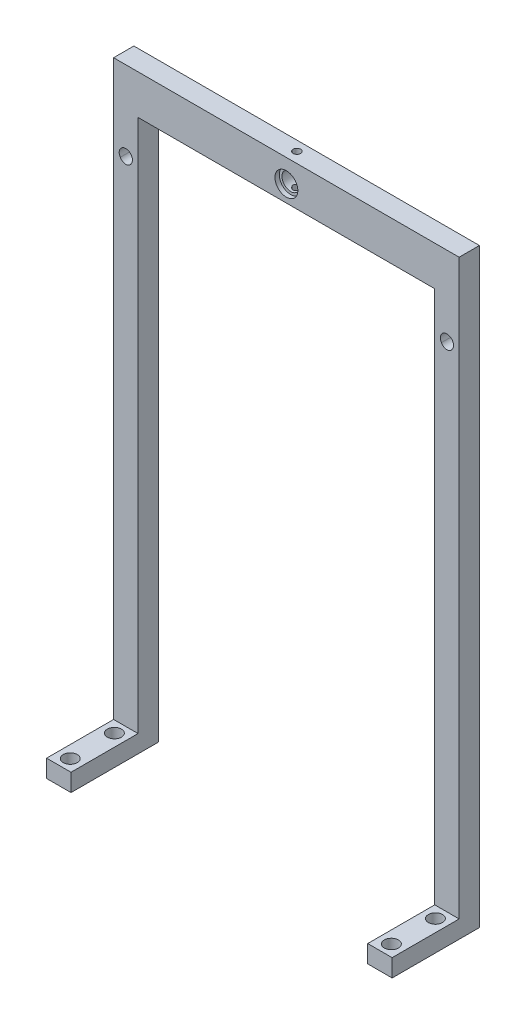
ISO-10303-21;
HEADER;
FILE_DESCRIPTION(('STEP AP214'),'2;1');
FILE_NAME('part.step','',(''),(''),'','','');
FILE_SCHEMA(('AUTOMOTIVE_DESIGN { 1 0 10303 214 1 1 1 1 }'));
ENDSEC;
DATA;
#1=APPLICATION_CONTEXT('core data for automotive mechanical design processes');
#2=APPLICATION_PROTOCOL_DEFINITION('international standard','automotive_design',2000,#1);
#3=PRODUCT_CONTEXT('',#1,'mechanical');
#4=PRODUCT('Part','Part','',(#3));
#5=PRODUCT_RELATED_PRODUCT_CATEGORY('part','',(#4));
#6=PRODUCT_DEFINITION_FORMATION('','',#4);
#7=PRODUCT_DEFINITION_CONTEXT('part definition',#1,'design');
#8=PRODUCT_DEFINITION('design','',#6,#7);
#9=PRODUCT_DEFINITION_SHAPE('','',#8);
#10=(LENGTH_UNIT() NAMED_UNIT(*) SI_UNIT(.MILLI.,.METRE.));
#11=(NAMED_UNIT(*) PLANE_ANGLE_UNIT() SI_UNIT($,.RADIAN.));
#12=(NAMED_UNIT(*) SI_UNIT($,.STERADIAN.) SOLID_ANGLE_UNIT());
#13=UNCERTAINTY_MEASURE_WITH_UNIT(LENGTH_MEASURE(1.E-05),#10,'distance_accuracy_value','');
#14=(GEOMETRIC_REPRESENTATION_CONTEXT(3) GLOBAL_UNCERTAINTY_ASSIGNED_CONTEXT((#13)) GLOBAL_UNIT_ASSIGNED_CONTEXT((#10,
#11,#12)) REPRESENTATION_CONTEXT('',''));
#15=CARTESIAN_POINT('',(0.,0.,0.));
#16=DIRECTION('',(0.,0.,1.));
#17=DIRECTION('',(1.,0.,0.));
#18=AXIS2_PLACEMENT_3D('',#15,#16,#17);
#19=CARTESIAN_POINT('',(-107.509028277649,163.576,-56.7765959430233));
#20=DIRECTION('',(0.,0.,1.));
#21=DIRECTION('',(1.,0.,0.));
#22=AXIS2_PLACEMENT_3D('',#19,#20,#21);
#23=CYLINDRICAL_SURFACE('',#22,2.54);
#24=CARTESIAN_POINT('',(-107.509028277649,161.036,-52.9030959430234));
#25=CARTESIAN_POINT('',(-107.566754056528,161.036004949209,-52.9031024767732));
#26=CARTESIAN_POINT('',(-107.62456541484,161.037990498758,-52.9077535295618));
#27=CARTESIAN_POINT('',(-107.738545101737,161.045741764065,-52.9261901695404));
#28=CARTESIAN_POINT('',(-107.794708856702,161.05151712185,-52.939999057043));
#29=CARTESIAN_POINT('',(-107.903555948322,161.066228536338,-52.976144809449));
#30=CARTESIAN_POINT('',(-107.956250543099,161.075153703491,-52.9984523137267));
#31=CARTESIAN_POINT('',(-108.057096773447,161.095300723254,-53.050838400811));
#32=CARTESIAN_POINT('',(-108.105249678348,161.106521931362,-53.080914803499));
#33=CARTESIAN_POINT('',(-108.198218460849,161.130793738901,-53.1496286471514));
#34=CARTESIAN_POINT('',(-108.242768366083,161.143905802221,-53.1886040243645));
#35=CARTESIAN_POINT('',(-108.324929780163,161.170221633979,-53.2732941637497));
#36=CARTESIAN_POINT('',(-108.362537497755,161.183425448464,-53.3190125840468));
#37=CARTESIAN_POINT('',(-108.431670032574,161.209195244001,-53.4187519693264));
#38=CARTESIAN_POINT('',(-108.462780148128,161.221693018099,-53.4730798659445));
#39=CARTESIAN_POINT('',(-108.515301683983,161.243655628489,-53.5868043819622));
#40=CARTESIAN_POINT('',(-108.536718299028,161.253122088465,-53.6461982661707));
#41=CARTESIAN_POINT('',(-108.568135316814,161.267282242767,-53.7653069340825));
#42=CARTESIAN_POINT('',(-108.578648720386,161.272189148273,-53.8248600535432));
#43=CARTESIAN_POINT('',(-108.589560031115,161.277284857388,-53.9450716504944));
#44=CARTESIAN_POINT('',(-108.58996384601,161.277476416503,-54.0057294616943));
#45=CARTESIAN_POINT('',(-108.581029754182,161.273299484289,-54.1212210328693));
#46=CARTESIAN_POINT('',(-108.572472173105,161.269296243058,-54.1761310659081));
#47=CARTESIAN_POINT('',(-108.547171100001,161.257800160635,-54.2836457653623));
#48=CARTESIAN_POINT('',(-108.530425964452,161.250306618834,-54.3362499666068));
#49=CARTESIAN_POINT('',(-108.48889604585,161.232503230194,-54.4390154129461));
#50=CARTESIAN_POINT('',(-108.463944905922,161.222135872553,-54.4890990161583));
#51=CARTESIAN_POINT('',(-108.406829387342,161.199765081749,-54.5845683931012));
#52=CARTESIAN_POINT('',(-108.374662101511,161.187760989959,-54.6299522626433));
#53=CARTESIAN_POINT('',(-108.30069639484,161.162181043929,-54.7189502224163));
#54=CARTESIAN_POINT('',(-108.258298491796,161.148559977934,-54.7620545402123));
#55=CARTESIAN_POINT('',(-108.166746471729,161.122171373586,-54.8407162353623));
#56=CARTESIAN_POINT('',(-108.117590648008,161.109404052058,-54.8762717004812));
#57=CARTESIAN_POINT('',(-108.012315593403,161.085763106793,-54.9396155749312));
#58=CARTESIAN_POINT('',(-107.956053477482,161.074944537042,-54.9671885962195));
#59=CARTESIAN_POINT('',(-107.839111777642,161.056846096832,-55.01229797408));
#60=CARTESIAN_POINT('',(-107.778434759068,161.049564189926,-55.0298401075729));
#61=CARTESIAN_POINT('',(-107.658638856613,161.039744737666,-55.0533042151602));
#62=CARTESIAN_POINT('',(-107.599676708101,161.03692858566,-55.0599098168799));
#63=CARTESIAN_POINT('',(-107.481423602037,161.035462621601,-55.0633614204787));
#64=CARTESIAN_POINT('',(-107.422132749196,161.036811551206,-55.0602103700113));
#65=CARTESIAN_POINT('',(-107.30815991757,161.043344538528,-55.0447203005117));
#66=CARTESIAN_POINT('',(-107.253398730006,161.048325190751,-55.0328683693606));
#67=CARTESIAN_POINT('',(-107.146706388447,161.061399923596,-55.0009987019312));
#68=CARTESIAN_POINT('',(-107.094775589222,161.069494393495,-54.9809799446524));
#69=CARTESIAN_POINT('',(-106.993386485371,161.088339120478,-54.9326934775513));
#70=CARTESIAN_POINT('',(-106.944055842566,161.099164346772,-54.9041879260995));
#71=CARTESIAN_POINT('',(-106.850700607611,161.122324842366,-54.8399974549462));
#72=CARTESIAN_POINT('',(-106.806678279594,161.134660751523,-54.80430948896));
#73=CARTESIAN_POINT('',(-106.721752604574,161.160650506563,-54.7236727892713));
#74=CARTESIAN_POINT('',(-106.68132310147,161.174334223917,-54.6782333734531));
#75=CARTESIAN_POINT('',(-106.608523009312,161.200669998012,-54.5810101575556));
#76=CARTESIAN_POINT('',(-106.576154533315,161.213321783666,-54.5292246992686));
#77=CARTESIAN_POINT('',(-106.519964167941,161.236279331013,-54.4195508625652));
#78=CARTESIAN_POINT('',(-106.496294952322,161.246542121484,-54.3615745912061));
#79=CARTESIAN_POINT('',(-106.459263961427,161.262990488762,-54.2418840818804));
#80=CARTESIAN_POINT('',(-106.445893221838,161.269179610811,-54.180173145344));
#81=CARTESIAN_POINT('',(-106.43074634322,161.276223610781,-54.0600442892869));
#82=CARTESIAN_POINT('',(-106.428133852785,161.277463024887,-54.0017539755865));
#83=CARTESIAN_POINT('',(-106.432326449693,161.275495943584,-53.8855956958247));
#84=CARTESIAN_POINT('',(-106.439129944289,161.272290200089,-53.8277276599979));
#85=CARTESIAN_POINT('',(-106.461249572185,161.262151472107,-53.7170679132632));
#86=CARTESIAN_POINT('',(-106.476119615298,161.255414382934,-53.6641673308636));
#87=CARTESIAN_POINT('',(-106.513504162709,161.239133473727,-53.5616048711624));
#88=CARTESIAN_POINT('',(-106.536020832798,161.229588858608,-53.5119439161917));
#89=CARTESIAN_POINT('',(-106.589649670089,161.208041865904,-53.4139370520736));
#90=CARTESIAN_POINT('',(-106.621204923353,161.195924518334,-53.3658593730151));
#91=CARTESIAN_POINT('',(-106.691408202969,161.170904355187,-53.2754202378993));
#92=CARTESIAN_POINT('',(-106.730058845152,161.158001251104,-53.2330609000291));
#93=CARTESIAN_POINT('',(-106.81688721804,161.131669597424,-53.1518986813878));
#94=CARTESIAN_POINT('',(-106.865569567185,161.118277169726,-53.1136213389222));
#95=CARTESIAN_POINT('',(-106.969156149136,161.093466954015,-53.0457441093074));
#96=CARTESIAN_POINT('',(-107.024063189022,161.082050062798,-53.0161481588635));
#97=CARTESIAN_POINT('',(-107.13778294314,161.062624857076,-52.9670786524232));
#98=CARTESIAN_POINT('',(-107.196523588025,161.054567360423,-52.9474580451362));
#99=CARTESIAN_POINT('',(-107.316783781995,161.04257078012,-52.9185651054773));
#100=CARTESIAN_POINT('',(-107.378294068086,161.03861889829,-52.9092606091975));
#101=CARTESIAN_POINT('',(-107.463046403608,161.036310416403,-52.9038279127191));
#102=CARTESIAN_POINT('',(-107.486030549066,161.035998028254,-52.9030933400025));
#103=CARTESIAN_POINT('',(-107.509028277649,161.036,-52.9030959430234));
#104=B_SPLINE_CURVE_WITH_KNOTS('',3,(#24,#25,#26,#27,#28,#29,#30,#31,#32,#33,#34,#35,#36,#37,
#38,#39,#40,#41,#42,#43,#44,#45,#46,#47,#48,#49,#50,#51,#52,#53,#54,#55,#56,#57,#58,#59,#60,#61,
#62,#63,#64,#65,#66,#67,#68,#69,#70,#71,#72,#73,#74,#75,#76,#77,#78,#79,#80,#81,#82,#83,#84,#85,
#86,#87,#88,#89,#90,#91,#92,#93,#94,#95,#96,#97,#98,#99,#100,#101,#102,#103),.UNSPECIFIED.,.T.,
.F.,(4,2,2,2,2,2,2,2,2,2,2,2,2,2,2,2,2,2,2,2,2,2,2,2,2,2,2,2,2,2,2,2,2,2,2,2,2,2,2,4),(0.,
0.173109941172707,0.346662025086487,0.519619888024115,0.692529267928443,0.873625999526085,
1.05482134060156,1.24537892761079,1.43583427363817,1.61685440897315,1.797768759139,
1.96414317527463,2.13055100220201,2.30056491047798,2.47064743587896,2.65574212649887,
2.84088364852489,3.03063409980792,3.22027516095429,3.39754013167779,3.57475155280992,
3.74273321092931,3.91073587622432,4.08397929751027,4.25729635214369,4.44347432982142,
4.62970105956506,4.81905553672167,5.0082450033598,5.18241214565643,5.35654983056322,
5.5219153070896,5.68732765999135,5.8629022753795,6.0385417496761,6.22771491601778,
6.41697373357776,6.60335522726164,6.78915396607244,6.85812030172787),.UNSPECIFIED.);
#105=CARTESIAN_POINT('',(-107.509028277649,161.036,-52.9030959430234));
#106=VERTEX_POINT('',#105);
#107=EDGE_CURVE('E181',#106,#106,#104,.T.);
#108=ORIENTED_EDGE('',*,*,#107,.T.);
#109=EDGE_LOOP('',(#108));
#110=FACE_BOUND('',#109,.T.);
#111=CARTESIAN_POINT('',(-107.509028277649,166.116,-52.9030959430234));
#112=CARTESIAN_POINT('',(-107.451302498771,166.115995050791,-52.9031024767732));
#113=CARTESIAN_POINT('',(-107.393491140458,166.114009501242,-52.9077535295618));
#114=CARTESIAN_POINT('',(-107.279511453561,166.106258235935,-52.9261901695404));
#115=CARTESIAN_POINT('',(-107.223347698597,166.10048287815,-52.939999057043));
#116=CARTESIAN_POINT('',(-107.114500606976,166.085771463662,-52.976144809449));
#117=CARTESIAN_POINT('',(-107.0618060122,166.076846296509,-52.9984523137267));
#118=CARTESIAN_POINT('',(-106.960959781851,166.056699276746,-53.050838400811));
#119=CARTESIAN_POINT('',(-106.912806876951,166.045478068638,-53.080914803499));
#120=CARTESIAN_POINT('',(-106.81983809445,166.021206261099,-53.1496286471514));
#121=CARTESIAN_POINT('',(-106.775288189216,166.008094197779,-53.1886040243645));
#122=CARTESIAN_POINT('',(-106.693126775136,165.981778366021,-53.2732941637497));
#123=CARTESIAN_POINT('',(-106.655519057543,165.968574551536,-53.3190125840468));
#124=CARTESIAN_POINT('',(-106.586386522724,165.942804755999,-53.4187519693264));
#125=CARTESIAN_POINT('',(-106.555276407171,165.930306981902,-53.4730798659445));
#126=CARTESIAN_POINT('',(-106.502754871315,165.908344371511,-53.5868043819622));
#127=CARTESIAN_POINT('',(-106.481338256271,165.898877911535,-53.6461982661707));
#128=CARTESIAN_POINT('',(-106.449921238485,165.884717757233,-53.7653069340825));
#129=CARTESIAN_POINT('',(-106.439407834913,165.879810851727,-53.8248600535432));
#130=CARTESIAN_POINT('',(-106.428496524184,165.874715142612,-53.9450716504944));
#131=CARTESIAN_POINT('',(-106.428092709289,165.874523583497,-54.0057294616943));
#132=CARTESIAN_POINT('',(-106.437026801116,165.878700515711,-54.1212210328693));
#133=CARTESIAN_POINT('',(-106.445584382194,165.882703756942,-54.1761310659081));
#134=CARTESIAN_POINT('',(-106.470885455297,165.894199839365,-54.2836457653624));
#135=CARTESIAN_POINT('',(-106.487630590847,165.901693381166,-54.3362499666069));
#136=CARTESIAN_POINT('',(-106.529160509449,165.919496769806,-54.4390154129461));
#137=CARTESIAN_POINT('',(-106.554111649377,165.929864127447,-54.4890990161583));
#138=CARTESIAN_POINT('',(-106.611227167957,165.952234918251,-54.5845683931012));
#139=CARTESIAN_POINT('',(-106.643394453788,165.964239010041,-54.6299522626433));
#140=CARTESIAN_POINT('',(-106.717360160459,165.989818956071,-54.7189502224163));
#141=CARTESIAN_POINT('',(-106.759758063502,166.003440022066,-54.7620545402123));
#142=CARTESIAN_POINT('',(-106.85131008357,166.029828626414,-54.8407162353623));
#143=CARTESIAN_POINT('',(-106.900465907291,166.042595947942,-54.8762717004812));
#144=CARTESIAN_POINT('',(-107.005740961896,166.066236893207,-54.9396155749312));
#145=CARTESIAN_POINT('',(-107.062003077817,166.077055462958,-54.9671885962195));
#146=CARTESIAN_POINT('',(-107.178944777657,166.095153903168,-55.01229797408));
#147=CARTESIAN_POINT('',(-107.239621796231,166.102435810074,-55.0298401075729));
#148=CARTESIAN_POINT('',(-107.359417698685,166.112255262334,-55.0533042151602));
#149=CARTESIAN_POINT('',(-107.418379847198,166.11507141434,-55.0599098168799));
#150=CARTESIAN_POINT('',(-107.536632953261,166.116537378399,-55.0633614204787));
#151=CARTESIAN_POINT('',(-107.595923806102,166.115188448794,-55.0602103700113));
#152=CARTESIAN_POINT('',(-107.709896637729,166.108655461472,-55.0447203005116));
#153=CARTESIAN_POINT('',(-107.764657825293,166.103674809249,-55.0328683693606));
#154=CARTESIAN_POINT('',(-107.871350166852,166.090600076404,-55.0009987019312));
#155=CARTESIAN_POINT('',(-107.923280966076,166.082505606505,-54.9809799446524));
#156=CARTESIAN_POINT('',(-108.024670069927,166.063660879522,-54.9326934775513));
#157=CARTESIAN_POINT('',(-108.074000712732,166.052835653228,-54.9041879260994));
#158=CARTESIAN_POINT('',(-108.167355947687,166.029675157634,-54.8399974549462));
#159=CARTESIAN_POINT('',(-108.211378275705,166.017339248477,-54.80430948896));
#160=CARTESIAN_POINT('',(-108.296303950725,165.991349493437,-54.7236727892713));
#161=CARTESIAN_POINT('',(-108.336733453829,165.977665776083,-54.6782333734531));
#162=CARTESIAN_POINT('',(-108.409533545987,165.951330001989,-54.5810101575555));
#163=CARTESIAN_POINT('',(-108.441902021984,165.938678216334,-54.5292246992686));
#164=CARTESIAN_POINT('',(-108.498092387358,165.915720668987,-54.4195508625652));
#165=CARTESIAN_POINT('',(-108.521761602976,165.905457878516,-54.3615745912061));
#166=CARTESIAN_POINT('',(-108.558792593872,165.889009511238,-54.2418840818804));
#167=CARTESIAN_POINT('',(-108.572163333461,165.882820389189,-54.1801731453439));
#168=CARTESIAN_POINT('',(-108.587310212079,165.875776389219,-54.0600442892869));
#169=CARTESIAN_POINT('',(-108.589922702514,165.874536975113,-54.0017539755865));
#170=CARTESIAN_POINT('',(-108.585730105606,165.876504056416,-53.8855956958247));
#171=CARTESIAN_POINT('',(-108.57892661101,165.879709799911,-53.8277276599979));
#172=CARTESIAN_POINT('',(-108.556806983113,165.889848527893,-53.7170679132632));
#173=CARTESIAN_POINT('',(-108.541936940001,165.896585617066,-53.6641673308636));
#174=CARTESIAN_POINT('',(-108.504552392589,165.912866526273,-53.5616048711624));
#175=CARTESIAN_POINT('',(-108.4820357225,165.922411141392,-53.5119439161917));
#176=CARTESIAN_POINT('',(-108.42840688521,165.943958134096,-53.4139370520736));
#177=CARTESIAN_POINT('',(-108.396851631946,165.956075481666,-53.3658593730151));
#178=CARTESIAN_POINT('',(-108.32664835233,165.981095644813,-53.2754202378993));
#179=CARTESIAN_POINT('',(-108.287997710147,165.993998748896,-53.2330609000291));
#180=CARTESIAN_POINT('',(-108.201169337258,166.020330402576,-53.1518986813878));
#181=CARTESIAN_POINT('',(-108.152486988113,166.033722830274,-53.1136213389222));
#182=CARTESIAN_POINT('',(-108.048900406162,166.058533045985,-53.0457441093074));
#183=CARTESIAN_POINT('',(-107.993993366277,166.069949937202,-53.0161481588635));
#184=CARTESIAN_POINT('',(-107.880273612159,166.089375142924,-52.9670786524232));
#185=CARTESIAN_POINT('',(-107.821532967273,166.097432639577,-52.9474580451362));
#186=CARTESIAN_POINT('',(-107.701272773304,166.10942921988,-52.9185651054773));
#187=CARTESIAN_POINT('',(-107.639762487213,166.11338110171,-52.9092606091975));
#188=CARTESIAN_POINT('',(-107.55501015169,166.115689583597,-52.9038279127191));
#189=CARTESIAN_POINT('',(-107.532026006232,166.116001971746,-52.9030933400025));
#190=CARTESIAN_POINT('',(-107.509028277649,166.116,-52.9030959430234));
#191=B_SPLINE_CURVE_WITH_KNOTS('',3,(#111,#112,#113,#114,#115,#116,#117,#118,#119,#120,#121,
#122,#123,#124,#125,#126,#127,#128,#129,#130,#131,#132,#133,#134,#135,#136,#137,#138,#139,#140,
#141,#142,#143,#144,#145,#146,#147,#148,#149,#150,#151,#152,#153,#154,#155,#156,#157,#158,#159,
#160,#161,#162,#163,#164,#165,#166,#167,#168,#169,#170,#171,#172,#173,#174,#175,#176,#177,#178,
#179,#180,#181,#182,#183,#184,#185,#186,#187,#188,#189,#190),.UNSPECIFIED.,.T.,.F.,(4,2,2,2,2,2,
2,2,2,2,2,2,2,2,2,2,2,2,2,2,2,2,2,2,2,2,2,2,2,2,2,2,2,2,2,2,2,2,2,4),(0.,0.173109941172707,
0.346662025086501,0.519619888024129,0.692529267928457,0.873625999526099,1.05482134060157,
1.2453789276108,1.43583427363819,1.61685440897316,1.79776875913903,1.96414317527467,
2.13055100220204,2.30056491047798,2.47064743587895,2.65574212649886,2.84088364852491,
3.03063409980796,3.22027516095432,3.39754013167785,3.57475155280994,3.74273321092934,
3.91073587622435,4.08397929751031,4.25729635214372,4.44347432982147,4.62970105956509,
4.81905553672169,5.00824500335982,5.18241214565646,5.35654983056325,5.52191530708963,
5.68732765999137,5.86290227537952,6.03854174967612,6.2277149160178,6.4169737335778,
6.60335522726167,6.78915396607246,6.85812030172788),.UNSPECIFIED.);
#192=CARTESIAN_POINT('',(-107.509028277649,166.116,-52.9030959430234));
#193=VERTEX_POINT('',#192);
#194=EDGE_CURVE('E174',#193,#193,#191,.T.);
#195=ORIENTED_EDGE('',*,*,#194,.T.);
#196=EDGE_LOOP('',(#195));
#197=FACE_BOUND('',#196,.T.);
#198=CARTESIAN_POINT('',(-107.509028277649,163.576,-56.7765959430233));
#199=DIRECTION('',(0.,0.,1.));
#200=DIRECTION('',(1.,0.,0.));
#201=AXIS2_PLACEMENT_3D('',#198,#199,#200);
#202=CIRCLE('',#201,2.54);
#203=CARTESIAN_POINT('',(-104.969028277649,163.576,-56.7765959430233));
#204=VERTEX_POINT('',#203);
#205=EDGE_CURVE('E223',#204,#204,#202,.T.);
#206=ORIENTED_EDGE('',*,*,#205,.F.);
#207=EDGE_LOOP('',(#206));
#208=FACE_BOUND('',#207,.T.);
#209=CARTESIAN_POINT('',(-107.509028277649,163.576,-52.2045959430234));
#210=DIRECTION('',(0.,0.,1.));
#211=DIRECTION('',(1.,0.,0.));
#212=AXIS2_PLACEMENT_3D('',#209,#210,#211);
#213=CIRCLE('',#212,2.54);
#214=CARTESIAN_POINT('',(-104.969028277649,163.576,-52.2045959430234));
#215=VERTEX_POINT('',#214);
#216=EDGE_CURVE('E226',#215,#215,#213,.F.);
#217=ORIENTED_EDGE('',*,*,#216,.F.);
#218=EDGE_LOOP('',(#217));
#219=FACE_BOUND('',#218,.T.);
#220=ADVANCED_FACE('F33',(#110,#197,#208,#219),#23,.F.);
#221=CARTESIAN_POINT('',(-157.280328277649,170.18,-50.9345959430234));
#222=DIRECTION('',(0.,0.,-1.));
#223=DIRECTION('',(-1.,0.,0.));
#224=AXIS2_PLACEMENT_3D('',#221,#222,#223);
#225=PLANE('',#224);
#226=CARTESIAN_POINT('',(-61.2556282776494,147.116,-50.9345959430234));
#227=DIRECTION('',(0.,0.,1.));
#228=DIRECTION('',(1.,0.,0.));
#229=AXIS2_PLACEMENT_3D('',#226,#227,#228);
#230=CIRCLE('',#229,1.778);
#231=CARTESIAN_POINT('',(-62.8466169443281,146.32225,-50.9345959430234));
#232=VERTEX_POINT('',#231);
#233=CARTESIAN_POINT('',(-59.6646396109707,146.32225,-50.9345959430234));
#234=VERTEX_POINT('',#233);
#235=EDGE_CURVE('E153',#232,#234,#230,.T.);
#236=ORIENTED_EDGE('',*,*,#235,.F.);
#237=CARTESIAN_POINT('',(-61.2556282776494,147.37,-50.9345959430234));
#238=DIRECTION('',(0.,0.,1.));
#239=DIRECTION('',(1.,0.,0.));
#240=AXIS2_PLACEMENT_3D('',#237,#238,#239);
#241=CIRCLE('',#240,1.905);
#242=EDGE_CURVE('E144',#234,#232,#241,.T.);
#243=ORIENTED_EDGE('',*,*,#242,.F.);
#244=EDGE_LOOP('',(#236,#243));
#245=FACE_BOUND('',#244,.T.);
#246=CARTESIAN_POINT('',(-153.762428277649,147.116,-50.9345959430234));
#247=DIRECTION('',(0.,0.,1.));
#248=DIRECTION('',(1.,0.,0.));
#249=AXIS2_PLACEMENT_3D('',#246,#247,#248);
#250=CIRCLE('',#249,1.778);
#251=CARTESIAN_POINT('',(-155.353416944328,146.32225,-50.9345959430234));
#252=VERTEX_POINT('',#251);
#253=CARTESIAN_POINT('',(-152.171439610971,146.32225,-50.9345959430234));
#254=VERTEX_POINT('',#253);
#255=EDGE_CURVE('E159',#252,#254,#250,.T.);
#256=ORIENTED_EDGE('',*,*,#255,.F.);
#257=CARTESIAN_POINT('',(-153.762428277649,147.37,-50.9345959430234));
#258=DIRECTION('',(0.,0.,1.));
#259=DIRECTION('',(1.,0.,0.));
#260=AXIS2_PLACEMENT_3D('',#257,#258,#259);
#261=CIRCLE('',#260,1.90499999999999);
#262=EDGE_CURVE('E161',#254,#252,#261,.T.);
#263=ORIENTED_EDGE('',*,*,#262,.F.);
#264=EDGE_LOOP('',(#256,#263));
#265=FACE_BOUND('',#264,.T.);
#266=CARTESIAN_POINT('',(-107.509028277649,163.576,-50.9345959430234));
#267=DIRECTION('',(0.,0.,1.));
#268=DIRECTION('',(1.,0.,0.));
#269=AXIS2_PLACEMENT_3D('',#266,#267,#268);
#270=CIRCLE('',#269,3.302);
#271=CARTESIAN_POINT('',(-104.207028277649,163.576,-50.9345959430234));
#272=VERTEX_POINT('',#271);
#273=EDGE_CURVE('E233',#272,#272,#270,.T.);
#274=ORIENTED_EDGE('',*,*,#273,.F.);
#275=EDGE_LOOP('',(#274));
#276=FACE_BOUND('',#275,.T.);
#277=DIRECTION('',(-1.,0.,0.));
#278=VECTOR('',#277,1.);
#279=CARTESIAN_POINT('',(-64.7735282776494,5.08,-50.9345959430234));
#280=LINE('',#279,#278);
#281=CARTESIAN_POINT('',(-57.7377282776494,5.08,-50.9345959430234));
#282=VERTEX_POINT('',#281);
#283=CARTESIAN_POINT('',(-64.7735282776494,5.08,-50.9345959430234));
#284=VERTEX_POINT('',#283);
#285=EDGE_CURVE('E262',#282,#284,#280,.T.);
#286=ORIENTED_EDGE('',*,*,#285,.F.);
#287=DIRECTION('',(0.,-1.,0.));
#288=VECTOR('',#287,1.);
#289=CARTESIAN_POINT('',(-57.7377282776494,170.18,-50.9345959430234));
#290=LINE('',#289,#288);
#291=CARTESIAN_POINT('',(-57.7377282776494,170.18,-50.9345959430234));
#292=VERTEX_POINT('',#291);
#293=EDGE_CURVE('E264',#292,#282,#290,.T.);
#294=ORIENTED_EDGE('',*,*,#293,.F.);
#295=DIRECTION('',(1.,0.,0.));
#296=VECTOR('',#295,1.);
#297=CARTESIAN_POINT('',(-157.280328277649,170.18,-50.9345959430234));
#298=LINE('',#297,#296);
#299=CARTESIAN_POINT('',(-157.280328277649,170.18,-50.9345959430234));
#300=VERTEX_POINT('',#299);
#301=EDGE_CURVE('E333',#300,#292,#298,.T.);
#302=ORIENTED_EDGE('',*,*,#301,.F.);
#303=DIRECTION('',(0.,-1.,0.));
#304=VECTOR('',#303,1.);
#305=CARTESIAN_POINT('',(-157.280328277649,170.18,-50.9345959430234));
#306=LINE('',#305,#304);
#307=CARTESIAN_POINT('',(-157.280328277649,5.08,-50.9345959430234));
#308=VERTEX_POINT('',#307);
#309=EDGE_CURVE('E243',#300,#308,#306,.T.);
#310=ORIENTED_EDGE('',*,*,#309,.T.);
#311=DIRECTION('',(-1.,0.,0.));
#312=VECTOR('',#311,1.);
#313=CARTESIAN_POINT('',(-157.280328277649,5.08,-50.9345959430234));
#314=LINE('',#313,#312);
#315=CARTESIAN_POINT('',(-150.244528277649,5.08,-50.9345959430234));
#316=VERTEX_POINT('',#315);
#317=EDGE_CURVE('E294',#316,#308,#314,.T.);
#318=ORIENTED_EDGE('',*,*,#317,.F.);
#319=DIRECTION('',(0.,-1.,0.));
#320=VECTOR('',#319,1.);
#321=CARTESIAN_POINT('',(-150.244528277649,0.,-50.9345959430234));
#322=LINE('',#321,#320);
#323=CARTESIAN_POINT('',(-150.244528277649,158.8,-50.9345959430234));
#324=VERTEX_POINT('',#323);
#325=EDGE_CURVE('E291',#324,#316,#322,.T.);
#326=ORIENTED_EDGE('',*,*,#325,.F.);
#327=DIRECTION('',(-1.,0.,0.));
#328=VECTOR('',#327,1.);
#329=CARTESIAN_POINT('',(-150.244528277649,158.8,-50.9345959430234));
#330=LINE('',#329,#328);
#331=CARTESIAN_POINT('',(-64.7735282776494,158.8,-50.9345959430234));
#332=VERTEX_POINT('',#331);
#333=EDGE_CURVE('E310',#332,#324,#330,.T.);
#334=ORIENTED_EDGE('',*,*,#333,.F.);
#335=DIRECTION('',(0.,1.,0.));
#336=VECTOR('',#335,1.);
#337=CARTESIAN_POINT('',(-64.7735282776494,0.,-50.9345959430234));
#338=LINE('',#337,#336);
#339=EDGE_CURVE('E267',#284,#332,#338,.T.);
#340=ORIENTED_EDGE('',*,*,#339,.F.);
#341=EDGE_LOOP('',(#286,#294,#302,#310,#318,#326,#334,#340));
#342=FACE_BOUND('',#341,.T.);
#343=ADVANCED_FACE('F156',(#245,#265,#276,#342),#225,.F.);
#344=CARTESIAN_POINT('',(0.,0.,0.));
#345=DIRECTION('',(0.,1.,0.));
#346=DIRECTION('',(0.,0.,1.));
#347=AXIS2_PLACEMENT_3D('',#344,#345,#346);
#348=PLANE('',#347);
#349=CARTESIAN_POINT('',(-153.762428277649,0.,-47.6325959430234));
#350=DIRECTION('',(0.,1.,0.));
#351=DIRECTION('',(-1.,0.,0.));
#352=AXIS2_PLACEMENT_3D('',#349,#350,#351);
#353=CIRCLE('',#352,2.03200000000001);
#354=CARTESIAN_POINT('',(-155.794428277649,0.,-47.6325959430234));
#355=VERTEX_POINT('',#354);
#356=EDGE_CURVE('E426',#355,#355,#353,.T.);
#357=ORIENTED_EDGE('',*,*,#356,.T.);
#358=EDGE_LOOP('',(#357));
#359=FACE_BOUND('',#358,.T.);
#360=CARTESIAN_POINT('',(-153.762428277649,0.,-34.9325959430234));
#361=DIRECTION('',(0.,1.,0.));
#362=DIRECTION('',(-1.,0.,0.));
#363=AXIS2_PLACEMENT_3D('',#360,#361,#362);
#364=CIRCLE('',#363,2.03200000000001);
#365=CARTESIAN_POINT('',(-155.794428277649,0.,-34.9325959430234));
#366=VERTEX_POINT('',#365);
#367=EDGE_CURVE('E271',#366,#366,#364,.T.);
#368=ORIENTED_EDGE('',*,*,#367,.T.);
#369=EDGE_LOOP('',(#368));
#370=FACE_BOUND('',#369,.T.);
#371=DIRECTION('',(-1.,0.,0.));
#372=VECTOR('',#371,1.);
#373=CARTESIAN_POINT('',(-157.280328277649,0.,-56.7765959430233));
#374=LINE('',#373,#372);
#375=CARTESIAN_POINT('',(-150.244528277649,0.,-56.7765959430233));
#376=VERTEX_POINT('',#375);
#377=CARTESIAN_POINT('',(-157.280328277649,0.,-56.7765959430233));
#378=VERTEX_POINT('',#377);
#379=EDGE_CURVE('E342',#376,#378,#374,.T.);
#380=ORIENTED_EDGE('',*,*,#379,.F.);
#381=DIRECTION('',(0.,0.,1.));
#382=VECTOR('',#381,1.);
#383=CARTESIAN_POINT('',(-150.244528277649,0.,-56.7765959430233));
#384=LINE('',#383,#382);
#385=CARTESIAN_POINT('',(-150.244528277649,0.,-31.6305959430234));
#386=VERTEX_POINT('',#385);
#387=EDGE_CURVE('E315',#376,#386,#384,.T.);
#388=ORIENTED_EDGE('',*,*,#387,.T.);
#389=DIRECTION('',(1.,0.,0.));
#390=VECTOR('',#389,1.);
#391=CARTESIAN_POINT('',(-157.280328277649,0.,-31.6305959430234));
#392=LINE('',#391,#390);
#393=CARTESIAN_POINT('',(-157.280328277649,0.,-31.6305959430234));
#394=VERTEX_POINT('',#393);
#395=EDGE_CURVE('E357',#394,#386,#392,.T.);
#396=ORIENTED_EDGE('',*,*,#395,.F.);
#397=DIRECTION('',(0.,0.,1.));
#398=VECTOR('',#397,1.);
#399=CARTESIAN_POINT('',(-157.280328277649,0.,-56.7765959430233));
#400=LINE('',#399,#398);
#401=EDGE_CURVE('E323',#378,#394,#400,.T.);
#402=ORIENTED_EDGE('',*,*,#401,.F.);
#403=EDGE_LOOP('',(#380,#388,#396,#402));
#404=FACE_BOUND('',#403,.T.);
#405=ADVANCED_FACE('F214',(#359,#370,#404),#348,.F.);
#406=CARTESIAN_POINT('',(-157.280328277649,170.18,-56.7765959430233));
#407=DIRECTION('',(1.,0.,0.));
#408=DIRECTION('',(0.,0.,-1.));
#409=AXIS2_PLACEMENT_3D('',#406,#407,#408);
#410=PLANE('',#409);
#411=ORIENTED_EDGE('',*,*,#401,.T.);
#412=DIRECTION('',(0.,-1.,0.));
#413=VECTOR('',#412,1.);
#414=CARTESIAN_POINT('',(-157.280328277649,0.,-31.6305959430234));
#415=LINE('',#414,#413);
#416=CARTESIAN_POINT('',(-157.280328277649,5.08,-31.6305959430234));
#417=VERTEX_POINT('',#416);
#418=EDGE_CURVE('E298',#417,#394,#415,.T.);
#419=ORIENTED_EDGE('',*,*,#418,.F.);
#420=DIRECTION('',(0.,0.,-1.));
#421=VECTOR('',#420,1.);
#422=CARTESIAN_POINT('',(-157.280328277649,5.08,-31.6305959430234));
#423=LINE('',#422,#421);
#424=EDGE_CURVE('E299',#417,#308,#423,.T.);
#425=ORIENTED_EDGE('',*,*,#424,.T.);
#426=ORIENTED_EDGE('',*,*,#309,.F.);
#427=DIRECTION('',(0.,0.,1.));
#428=VECTOR('',#427,1.);
#429=CARTESIAN_POINT('',(-157.280328277649,170.18,-56.7765959430233));
#430=LINE('',#429,#428);
#431=CARTESIAN_POINT('',(-157.280328277649,170.18,-56.7765959430233));
#432=VERTEX_POINT('',#431);
#433=EDGE_CURVE('E330',#432,#300,#430,.T.);
#434=ORIENTED_EDGE('',*,*,#433,.F.);
#435=DIRECTION('',(0.,-1.,0.));
#436=VECTOR('',#435,1.);
#437=CARTESIAN_POINT('',(-157.280328277649,170.18,-56.7765959430233));
#438=LINE('',#437,#436);
#439=EDGE_CURVE('E285',#432,#378,#438,.T.);
#440=ORIENTED_EDGE('',*,*,#439,.T.);
#441=EDGE_LOOP('',(#411,#419,#425,#426,#434,#440));
#442=FACE_BOUND('',#441,.T.);
#443=ADVANCED_FACE('F35',(#442),#410,.F.);
#444=CARTESIAN_POINT('',(-57.7377282776494,170.18,-56.7765959430233));
#445=DIRECTION('',(-1.,0.,0.));
#446=DIRECTION('',(0.,0.,1.));
#447=AXIS2_PLACEMENT_3D('',#444,#445,#446);
#448=PLANE('',#447);
#449=DIRECTION('',(0.,0.,-1.));
#450=VECTOR('',#449,1.);
#451=CARTESIAN_POINT('',(-57.7377282776494,0.,-56.7765959430233));
#452=LINE('',#451,#450);
#453=CARTESIAN_POINT('',(-57.7377282776494,0.,-31.6305959430234));
#454=VERTEX_POINT('',#453);
#455=CARTESIAN_POINT('',(-57.7377282776494,0.,-56.7765959430233));
#456=VERTEX_POINT('',#455);
#457=EDGE_CURVE('E340',#454,#456,#452,.T.);
#458=ORIENTED_EDGE('',*,*,#457,.T.);
#459=DIRECTION('',(0.,-1.,0.));
#460=VECTOR('',#459,1.);
#461=CARTESIAN_POINT('',(-57.7377282776494,170.18,-56.7765959430233));
#462=LINE('',#461,#460);
#463=CARTESIAN_POINT('',(-57.7377282776494,170.18,-56.7765959430233));
#464=VERTEX_POINT('',#463);
#465=EDGE_CURVE('E281',#464,#456,#462,.T.);
#466=ORIENTED_EDGE('',*,*,#465,.F.);
#467=DIRECTION('',(0.,0.,-1.));
#468=VECTOR('',#467,1.);
#469=CARTESIAN_POINT('',(-57.7377282776494,170.18,-56.7765959430233));
#470=LINE('',#469,#468);
#471=EDGE_CURVE('E280',#292,#464,#470,.T.);
#472=ORIENTED_EDGE('',*,*,#471,.F.);
#473=ORIENTED_EDGE('',*,*,#293,.T.);
#474=DIRECTION('',(0.,0.,-1.));
#475=VECTOR('',#474,1.);
#476=CARTESIAN_POINT('',(-57.7377282776494,5.08,-31.6305959430234));
#477=LINE('',#476,#475);
#478=CARTESIAN_POINT('',(-57.7377282776494,5.08,-31.6305959430234));
#479=VERTEX_POINT('',#478);
#480=EDGE_CURVE('E277',#479,#282,#477,.T.);
#481=ORIENTED_EDGE('',*,*,#480,.F.);
#482=DIRECTION('',(0.,1.,0.));
#483=VECTOR('',#482,1.);
#484=CARTESIAN_POINT('',(-57.7377282776494,0.,-31.6305959430234));
#485=LINE('',#484,#483);
#486=EDGE_CURVE('E443',#454,#479,#485,.T.);
#487=ORIENTED_EDGE('',*,*,#486,.F.);
#488=EDGE_LOOP('',(#458,#466,#472,#473,#481,#487));
#489=FACE_BOUND('',#488,.T.);
#490=ADVANCED_FACE('F275',(#489),#448,.F.);
#491=CARTESIAN_POINT('',(-157.280328277649,170.18,-56.7765959430233));
#492=DIRECTION('',(0.,0.,1.));
#493=DIRECTION('',(1.,0.,0.));
#494=AXIS2_PLACEMENT_3D('',#491,#492,#493);
#495=PLANE('',#494);
#496=CARTESIAN_POINT('',(-61.2556282776494,147.116,-56.7765959430233));
#497=DIRECTION('',(0.,0.,1.));
#498=DIRECTION('',(1.,0.,0.));
#499=AXIS2_PLACEMENT_3D('',#496,#497,#498);
#500=CIRCLE('',#499,1.778);
#501=CARTESIAN_POINT('',(-62.8466169443281,146.32225,-56.7765959430233));
#502=VERTEX_POINT('',#501);
#503=CARTESIAN_POINT('',(-59.6646396109707,146.32225,-56.7765959430233));
#504=VERTEX_POINT('',#503);
#505=EDGE_CURVE('E155',#502,#504,#500,.T.);
#506=ORIENTED_EDGE('',*,*,#505,.T.);
#507=CARTESIAN_POINT('',(-61.2556282776494,147.37,-56.7765959430233));
#508=DIRECTION('',(0.,0.,1.));
#509=DIRECTION('',(1.,0.,0.));
#510=AXIS2_PLACEMENT_3D('',#507,#508,#509);
#511=CIRCLE('',#510,1.905);
#512=EDGE_CURVE('E48',#504,#502,#511,.T.);
#513=ORIENTED_EDGE('',*,*,#512,.T.);
#514=EDGE_LOOP('',(#506,#513));
#515=FACE_BOUND('',#514,.T.);
#516=CARTESIAN_POINT('',(-153.762428277649,147.116,-56.7765959430233));
#517=DIRECTION('',(0.,0.,1.));
#518=DIRECTION('',(1.,0.,0.));
#519=AXIS2_PLACEMENT_3D('',#516,#517,#518);
#520=CIRCLE('',#519,1.778);
#521=CARTESIAN_POINT('',(-155.353416944328,146.32225,-56.7765959430233));
#522=VERTEX_POINT('',#521);
#523=CARTESIAN_POINT('',(-152.171439610971,146.32225,-56.7765959430233));
#524=VERTEX_POINT('',#523);
#525=EDGE_CURVE('E165',#522,#524,#520,.T.);
#526=ORIENTED_EDGE('',*,*,#525,.T.);
#527=CARTESIAN_POINT('',(-153.762428277649,147.37,-56.7765959430233));
#528=DIRECTION('',(0.,0.,1.));
#529=DIRECTION('',(1.,0.,0.));
#530=AXIS2_PLACEMENT_3D('',#527,#528,#529);
#531=CIRCLE('',#530,1.90499999999999);
#532=EDGE_CURVE('E56',#524,#522,#531,.T.);
#533=ORIENTED_EDGE('',*,*,#532,.T.);
#534=EDGE_LOOP('',(#526,#533));
#535=FACE_BOUND('',#534,.T.);
#536=ORIENTED_EDGE('',*,*,#205,.T.);
#537=EDGE_LOOP('',(#536));
#538=FACE_BOUND('',#537,.T.);
#539=DIRECTION('',(-1.,0.,0.));
#540=VECTOR('',#539,1.);
#541=CARTESIAN_POINT('',(-150.244528277649,158.8,-56.7765959430233));
#542=LINE('',#541,#540);
#543=CARTESIAN_POINT('',(-64.7735282776494,158.8,-56.7765959430233));
#544=VERTEX_POINT('',#543);
#545=CARTESIAN_POINT('',(-150.244528277649,158.8,-56.7765959430233));
#546=VERTEX_POINT('',#545);
#547=EDGE_CURVE('E313',#544,#546,#542,.T.);
#548=ORIENTED_EDGE('',*,*,#547,.T.);
#549=DIRECTION('',(0.,-1.,0.));
#550=VECTOR('',#549,1.);
#551=CARTESIAN_POINT('',(-150.244528277649,0.,-56.7765959430233));
#552=LINE('',#551,#550);
#553=EDGE_CURVE('E306',#546,#376,#552,.T.);
#554=ORIENTED_EDGE('',*,*,#553,.T.);
#555=ORIENTED_EDGE('',*,*,#379,.T.);
#556=ORIENTED_EDGE('',*,*,#439,.F.);
#557=DIRECTION('',(-1.,0.,0.));
#558=VECTOR('',#557,1.);
#559=CARTESIAN_POINT('',(-157.280328277649,170.18,-56.7765959430233));
#560=LINE('',#559,#558);
#561=EDGE_CURVE('E337',#464,#432,#560,.T.);
#562=ORIENTED_EDGE('',*,*,#561,.F.);
#563=ORIENTED_EDGE('',*,*,#465,.T.);
#564=CARTESIAN_POINT('',(-64.7735282776494,0.,-56.7765959430233));
#565=VERTEX_POINT('',#564);
#566=EDGE_CURVE('E334',#456,#565,#374,.T.);
#567=ORIENTED_EDGE('',*,*,#566,.T.);
#568=DIRECTION('',(0.,1.,0.));
#569=VECTOR('',#568,1.);
#570=CARTESIAN_POINT('',(-64.7735282776494,0.,-56.7765959430233));
#571=LINE('',#570,#569);
#572=EDGE_CURVE('E309',#565,#544,#571,.T.);
#573=ORIENTED_EDGE('',*,*,#572,.T.);
#574=EDGE_LOOP('',(#548,#554,#555,#556,#562,#563,#567,#573));
#575=FACE_BOUND('',#574,.T.);
#576=ADVANCED_FACE('F246',(#515,#535,#538,#575),#495,.F.);
#577=CARTESIAN_POINT('',(0.,170.18,0.));
#578=DIRECTION('',(0.,1.,0.));
#579=DIRECTION('',(0.,0.,1.));
#580=AXIS2_PLACEMENT_3D('',#577,#578,#579);
#581=PLANE('',#580);
#582=CARTESIAN_POINT('',(-107.509028277649,170.18,-53.9825959430234));
#583=DIRECTION('',(0.,1.,0.));
#584=DIRECTION('',(0.,0.,1.));
#585=AXIS2_PLACEMENT_3D('',#582,#583,#584);
#586=CIRCLE('',#585,1.0795);
#587=CARTESIAN_POINT('',(-107.509028277649,170.18,-52.9030959430234));
#588=VERTEX_POINT('',#587);
#589=EDGE_CURVE('E168',#588,#588,#586,.T.);
#590=ORIENTED_EDGE('',*,*,#589,.F.);
#591=EDGE_LOOP('',(#590));
#592=FACE_BOUND('',#591,.T.);
#593=ORIENTED_EDGE('',*,*,#433,.T.);
#594=ORIENTED_EDGE('',*,*,#301,.T.);
#595=ORIENTED_EDGE('',*,*,#471,.T.);
#596=ORIENTED_EDGE('',*,*,#561,.T.);
#597=EDGE_LOOP('',(#593,#594,#595,#596));
#598=FACE_BOUND('',#597,.T.);
#599=ADVANCED_FACE('F404',(#592,#598),#581,.T.);
#600=CARTESIAN_POINT('',(-61.2556282776494,0.,-47.6325959430234));
#601=DIRECTION('',(0.,1.,0.));
#602=DIRECTION('',(-1.,0.,0.));
#603=AXIS2_PLACEMENT_3D('',#600,#601,#602);
#604=CIRCLE('',#603,2.032);
#605=CARTESIAN_POINT('',(-63.2876282776494,0.,-47.6325959430234));
#606=VERTEX_POINT('',#605);
#607=EDGE_CURVE('E481',#606,#606,#604,.T.);
#608=ORIENTED_EDGE('',*,*,#607,.T.);
#609=EDGE_LOOP('',(#608));
#610=FACE_BOUND('',#609,.T.);
#611=CARTESIAN_POINT('',(-61.2556282776494,0.,-34.9325959430234));
#612=DIRECTION('',(0.,1.,0.));
#613=DIRECTION('',(-1.,0.,0.));
#614=AXIS2_PLACEMENT_3D('',#611,#612,#613);
#615=CIRCLE('',#614,2.032);
#616=CARTESIAN_POINT('',(-63.2876282776494,0.,-34.9325959430234));
#617=VERTEX_POINT('',#616);
#618=EDGE_CURVE('E488',#617,#617,#615,.T.);
#619=ORIENTED_EDGE('',*,*,#618,.T.);
#620=EDGE_LOOP('',(#619));
#621=FACE_BOUND('',#620,.T.);
#622=ORIENTED_EDGE('',*,*,#457,.F.);
#623=DIRECTION('',(1.,0.,0.));
#624=VECTOR('',#623,1.);
#625=CARTESIAN_POINT('',(-64.7735282776494,0.,-31.6305959430234));
#626=LINE('',#625,#624);
#627=CARTESIAN_POINT('',(-64.7735282776494,0.,-31.6305959430234));
#628=VERTEX_POINT('',#627);
#629=EDGE_CURVE('E440',#628,#454,#626,.T.);
#630=ORIENTED_EDGE('',*,*,#629,.F.);
#631=DIRECTION('',(0.,0.,1.));
#632=VECTOR('',#631,1.);
#633=CARTESIAN_POINT('',(-64.7735282776494,0.,-56.7765959430233));
#634=LINE('',#633,#632);
#635=EDGE_CURVE('E327',#565,#628,#634,.T.);
#636=ORIENTED_EDGE('',*,*,#635,.F.);
#637=ORIENTED_EDGE('',*,*,#566,.F.);
#638=EDGE_LOOP('',(#622,#630,#636,#637));
#639=FACE_BOUND('',#638,.T.);
#640=ADVANCED_FACE('F403',(#610,#621,#639),#348,.F.);
#641=CARTESIAN_POINT('',(-150.244528277649,0.,-56.7765959430233));
#642=DIRECTION('',(-1.,0.,0.));
#643=DIRECTION('',(0.,0.,1.));
#644=AXIS2_PLACEMENT_3D('',#641,#642,#643);
#645=PLANE('',#644);
#646=ORIENTED_EDGE('',*,*,#325,.T.);
#647=DIRECTION('',(0.,0.,-1.));
#648=VECTOR('',#647,1.);
#649=CARTESIAN_POINT('',(-150.244528277649,5.08,-31.6305959430234));
#650=LINE('',#649,#648);
#651=CARTESIAN_POINT('',(-150.244528277649,5.08,-31.6305959430234));
#652=VERTEX_POINT('',#651);
#653=EDGE_CURVE('E371',#652,#316,#650,.T.);
#654=ORIENTED_EDGE('',*,*,#653,.F.);
#655=DIRECTION('',(0.,1.,0.));
#656=VECTOR('',#655,1.);
#657=CARTESIAN_POINT('',(-150.244528277649,0.,-31.6305959430234));
#658=LINE('',#657,#656);
#659=EDGE_CURVE('E361',#386,#652,#658,.T.);
#660=ORIENTED_EDGE('',*,*,#659,.F.);
#661=ORIENTED_EDGE('',*,*,#387,.F.);
#662=ORIENTED_EDGE('',*,*,#553,.F.);
#663=DIRECTION('',(0.,0.,1.));
#664=VECTOR('',#663,1.);
#665=CARTESIAN_POINT('',(-150.244528277649,158.8,-56.7765959430233));
#666=LINE('',#665,#664);
#667=EDGE_CURVE('E321',#546,#324,#666,.T.);
#668=ORIENTED_EDGE('',*,*,#667,.T.);
#669=EDGE_LOOP('',(#646,#654,#660,#661,#662,#668));
#670=FACE_BOUND('',#669,.T.);
#671=ADVANCED_FACE('F378',(#670),#645,.F.);
#672=CARTESIAN_POINT('',(-150.244528277649,158.8,-56.7765959430233));
#673=DIRECTION('',(0.,1.,0.));
#674=DIRECTION('',(0.,0.,1.));
#675=AXIS2_PLACEMENT_3D('',#672,#673,#674);
#676=PLANE('',#675);
#677=CARTESIAN_POINT('',(-107.509028277649,158.8,-53.9825959430234));
#678=DIRECTION('',(0.,1.,0.));
#679=DIRECTION('',(0.,0.,1.));
#680=AXIS2_PLACEMENT_3D('',#677,#678,#679);
#681=CIRCLE('',#680,1.0795);
#682=CARTESIAN_POINT('',(-107.509028277649,158.8,-52.9030959430234));
#683=VERTEX_POINT('',#682);
#684=EDGE_CURVE('E173',#683,#683,#681,.T.);
#685=ORIENTED_EDGE('',*,*,#684,.T.);
#686=EDGE_LOOP('',(#685));
#687=FACE_BOUND('',#686,.T.);
#688=ORIENTED_EDGE('',*,*,#333,.T.);
#689=ORIENTED_EDGE('',*,*,#667,.F.);
#690=ORIENTED_EDGE('',*,*,#547,.F.);
#691=DIRECTION('',(0.,0.,1.));
#692=VECTOR('',#691,1.);
#693=CARTESIAN_POINT('',(-64.7735282776494,158.8,-56.7765959430233));
#694=LINE('',#693,#692);
#695=EDGE_CURVE('E324',#544,#332,#694,.T.);
#696=ORIENTED_EDGE('',*,*,#695,.T.);
#697=EDGE_LOOP('',(#688,#689,#690,#696));
#698=FACE_BOUND('',#697,.T.);
#699=ADVANCED_FACE('F391',(#687,#698),#676,.F.);
#700=CARTESIAN_POINT('',(-64.7735282776494,0.,-56.7765959430233));
#701=DIRECTION('',(1.,0.,0.));
#702=DIRECTION('',(0.,0.,-1.));
#703=AXIS2_PLACEMENT_3D('',#700,#701,#702);
#704=PLANE('',#703);
#705=ORIENTED_EDGE('',*,*,#635,.T.);
#706=DIRECTION('',(0.,-1.,0.));
#707=VECTOR('',#706,1.);
#708=CARTESIAN_POINT('',(-64.7735282776494,0.,-31.6305959430234));
#709=LINE('',#708,#707);
#710=CARTESIAN_POINT('',(-64.7735282776494,5.08,-31.6305959430234));
#711=VERTEX_POINT('',#710);
#712=EDGE_CURVE('E270',#711,#628,#709,.T.);
#713=ORIENTED_EDGE('',*,*,#712,.F.);
#714=DIRECTION('',(0.,0.,-1.));
#715=VECTOR('',#714,1.);
#716=CARTESIAN_POINT('',(-64.7735282776494,5.08,-31.6305959430234));
#717=LINE('',#716,#715);
#718=EDGE_CURVE('E446',#711,#284,#717,.T.);
#719=ORIENTED_EDGE('',*,*,#718,.T.);
#720=ORIENTED_EDGE('',*,*,#339,.T.);
#721=ORIENTED_EDGE('',*,*,#695,.F.);
#722=ORIENTED_EDGE('',*,*,#572,.F.);
#723=EDGE_LOOP('',(#705,#713,#719,#720,#721,#722));
#724=FACE_BOUND('',#723,.T.);
#725=ADVANCED_FACE('F382',(#724),#704,.F.);
#726=CARTESIAN_POINT('',(-157.280328277649,5.08,-31.6305959430234));
#727=DIRECTION('',(0.,-1.,0.));
#728=DIRECTION('',(1.,0.,0.));
#729=AXIS2_PLACEMENT_3D('',#726,#727,#728);
#730=PLANE('',#729);
#731=CARTESIAN_POINT('',(-153.762428277649,5.08,-47.6325959430234));
#732=DIRECTION('',(0.,1.,0.));
#733=DIRECTION('',(-1.,0.,0.));
#734=AXIS2_PLACEMENT_3D('',#731,#732,#733);
#735=CIRCLE('',#734,2.03200000000001);
#736=CARTESIAN_POINT('',(-155.794428277649,5.08,-47.6325959430234));
#737=VERTEX_POINT('',#736);
#738=EDGE_CURVE('E435',#737,#737,#735,.T.);
#739=ORIENTED_EDGE('',*,*,#738,.F.);
#740=EDGE_LOOP('',(#739));
#741=FACE_BOUND('',#740,.T.);
#742=CARTESIAN_POINT('',(-153.762428277649,5.08,-34.9325959430234));
#743=DIRECTION('',(0.,1.,0.));
#744=DIRECTION('',(-1.,0.,0.));
#745=AXIS2_PLACEMENT_3D('',#742,#743,#744);
#746=CIRCLE('',#745,2.03200000000001);
#747=CARTESIAN_POINT('',(-155.794428277649,5.08,-34.9325959430234));
#748=VERTEX_POINT('',#747);
#749=EDGE_CURVE('E430',#748,#748,#746,.T.);
#750=ORIENTED_EDGE('',*,*,#749,.F.);
#751=EDGE_LOOP('',(#750));
#752=FACE_BOUND('',#751,.T.);
#753=ORIENTED_EDGE('',*,*,#317,.T.);
#754=ORIENTED_EDGE('',*,*,#424,.F.);
#755=DIRECTION('',(-1.,0.,0.));
#756=VECTOR('',#755,1.);
#757=CARTESIAN_POINT('',(-157.280328277649,5.08,-31.6305959430234));
#758=LINE('',#757,#756);
#759=EDGE_CURVE('E304',#652,#417,#758,.T.);
#760=ORIENTED_EDGE('',*,*,#759,.F.);
#761=ORIENTED_EDGE('',*,*,#653,.T.);
#762=EDGE_LOOP('',(#753,#754,#760,#761));
#763=FACE_BOUND('',#762,.T.);
#764=ADVANCED_FACE('F380',(#741,#752,#763),#730,.F.);
#765=CARTESIAN_POINT('',(0.,0.,-31.6305959430234));
#766=DIRECTION('',(0.,0.,-1.));
#767=DIRECTION('',(-1.,0.,0.));
#768=AXIS2_PLACEMENT_3D('',#765,#766,#767);
#769=PLANE('',#768);
#770=ORIENTED_EDGE('',*,*,#418,.T.);
#771=ORIENTED_EDGE('',*,*,#395,.T.);
#772=ORIENTED_EDGE('',*,*,#659,.T.);
#773=ORIENTED_EDGE('',*,*,#759,.T.);
#774=EDGE_LOOP('',(#770,#771,#772,#773));
#775=FACE_BOUND('',#774,.T.);
#776=ADVANCED_FACE('F363',(#775),#769,.F.);
#777=CARTESIAN_POINT('',(-64.7735282776494,5.08,-31.6305959430234));
#778=DIRECTION('',(0.,-1.,0.));
#779=DIRECTION('',(1.,0.,0.));
#780=AXIS2_PLACEMENT_3D('',#777,#778,#779);
#781=PLANE('',#780);
#782=CARTESIAN_POINT('',(-61.2556282776494,5.08000000000001,-47.6325959430234));
#783=DIRECTION('',(0.,1.,0.));
#784=DIRECTION('',(-1.,0.,0.));
#785=AXIS2_PLACEMENT_3D('',#782,#783,#784);
#786=CIRCLE('',#785,2.032);
#787=CARTESIAN_POINT('',(-63.2876282776494,5.08000000000001,-47.6325959430234));
#788=VERTEX_POINT('',#787);
#789=EDGE_CURVE('E230',#788,#788,#786,.T.);
#790=ORIENTED_EDGE('',*,*,#789,.F.);
#791=EDGE_LOOP('',(#790));
#792=FACE_BOUND('',#791,.T.);
#793=CARTESIAN_POINT('',(-61.2556282776494,5.08000000000001,-34.9325959430234));
#794=DIRECTION('',(0.,1.,0.));
#795=DIRECTION('',(-1.,0.,0.));
#796=AXIS2_PLACEMENT_3D('',#793,#794,#795);
#797=CIRCLE('',#796,2.032);
#798=CARTESIAN_POINT('',(-63.2876282776494,5.08000000000001,-34.9325959430234));
#799=VERTEX_POINT('',#798);
#800=EDGE_CURVE('E485',#799,#799,#797,.T.);
#801=ORIENTED_EDGE('',*,*,#800,.F.);
#802=EDGE_LOOP('',(#801));
#803=FACE_BOUND('',#802,.T.);
#804=ORIENTED_EDGE('',*,*,#285,.T.);
#805=ORIENTED_EDGE('',*,*,#718,.F.);
#806=DIRECTION('',(-1.,0.,0.));
#807=VECTOR('',#806,1.);
#808=CARTESIAN_POINT('',(-64.7735282776494,5.08,-31.6305959430234));
#809=LINE('',#808,#807);
#810=EDGE_CURVE('E445',#479,#711,#809,.T.);
#811=ORIENTED_EDGE('',*,*,#810,.F.);
#812=ORIENTED_EDGE('',*,*,#480,.T.);
#813=EDGE_LOOP('',(#804,#805,#811,#812));
#814=FACE_BOUND('',#813,.T.);
#815=ADVANCED_FACE('F389',(#792,#803,#814),#781,.F.);
#816=CARTESIAN_POINT('',(0.,0.,-31.6305959430234));
#817=DIRECTION('',(0.,0.,-1.));
#818=DIRECTION('',(-1.,0.,0.));
#819=AXIS2_PLACEMENT_3D('',#816,#817,#818);
#820=PLANE('',#819);
#821=ORIENTED_EDGE('',*,*,#712,.T.);
#822=ORIENTED_EDGE('',*,*,#629,.T.);
#823=ORIENTED_EDGE('',*,*,#486,.T.);
#824=ORIENTED_EDGE('',*,*,#810,.T.);
#825=EDGE_LOOP('',(#821,#822,#823,#824));
#826=FACE_BOUND('',#825,.T.);
#827=ADVANCED_FACE('F449',(#826),#820,.F.);
#828=CARTESIAN_POINT('',(-153.762428277649,0.,-34.9325959430234));
#829=DIRECTION('',(0.,1.,0.));
#830=DIRECTION('',(-1.,0.,0.));
#831=AXIS2_PLACEMENT_3D('',#828,#829,#830);
#832=CYLINDRICAL_SURFACE('',#831,2.03200000000001);
#833=ORIENTED_EDGE('',*,*,#367,.F.);
#834=EDGE_LOOP('',(#833));
#835=FACE_BOUND('',#834,.T.);
#836=ORIENTED_EDGE('',*,*,#749,.T.);
#837=EDGE_LOOP('',(#836));
#838=FACE_BOUND('',#837,.T.);
#839=ADVANCED_FACE('F458',(#835,#838),#832,.F.);
#840=CARTESIAN_POINT('',(-153.762428277649,0.,-47.6325959430234));
#841=DIRECTION('',(0.,1.,0.));
#842=DIRECTION('',(-1.,0.,0.));
#843=AXIS2_PLACEMENT_3D('',#840,#841,#842);
#844=CYLINDRICAL_SURFACE('',#843,2.03200000000001);
#845=ORIENTED_EDGE('',*,*,#356,.F.);
#846=EDGE_LOOP('',(#845));
#847=FACE_BOUND('',#846,.T.);
#848=ORIENTED_EDGE('',*,*,#738,.T.);
#849=EDGE_LOOP('',(#848));
#850=FACE_BOUND('',#849,.T.);
#851=ADVANCED_FACE('F464',(#847,#850),#844,.F.);
#852=CARTESIAN_POINT('',(-61.2556282776494,0.,-34.9325959430234));
#853=DIRECTION('',(0.,1.,0.));
#854=DIRECTION('',(-1.,0.,0.));
#855=AXIS2_PLACEMENT_3D('',#852,#853,#854);
#856=CYLINDRICAL_SURFACE('',#855,2.032);
#857=ORIENTED_EDGE('',*,*,#618,.F.);
#858=EDGE_LOOP('',(#857));
#859=FACE_BOUND('',#858,.T.);
#860=ORIENTED_EDGE('',*,*,#800,.T.);
#861=EDGE_LOOP('',(#860));
#862=FACE_BOUND('',#861,.T.);
#863=ADVANCED_FACE('F470',(#859,#862),#856,.F.);
#864=CARTESIAN_POINT('',(-61.2556282776494,0.,-47.6325959430234));
#865=DIRECTION('',(0.,1.,0.));
#866=DIRECTION('',(-1.,0.,0.));
#867=AXIS2_PLACEMENT_3D('',#864,#865,#866);
#868=CYLINDRICAL_SURFACE('',#867,2.032);
#869=ORIENTED_EDGE('',*,*,#607,.F.);
#870=EDGE_LOOP('',(#869));
#871=FACE_BOUND('',#870,.T.);
#872=ORIENTED_EDGE('',*,*,#789,.T.);
#873=EDGE_LOOP('',(#872));
#874=FACE_BOUND('',#873,.T.);
#875=ADVANCED_FACE('F201',(#871,#874),#868,.F.);
#876=CARTESIAN_POINT('',(-107.509028277649,163.576,-52.2045959430234));
#877=DIRECTION('',(0.,0.,1.));
#878=DIRECTION('',(1.,0.,0.));
#879=AXIS2_PLACEMENT_3D('',#876,#877,#878);
#880=PLANE('',#879);
#881=CARTESIAN_POINT('',(-107.509028277649,163.576,-52.2045959430234));
#882=DIRECTION('',(0.,0.,1.));
#883=DIRECTION('',(1.,0.,0.));
#884=AXIS2_PLACEMENT_3D('',#881,#882,#883);
#885=CIRCLE('',#884,3.302);
#886=CARTESIAN_POINT('',(-104.207028277649,163.576,-52.2045959430234));
#887=VERTEX_POINT('',#886);
#888=EDGE_CURVE('E228',#887,#887,#885,.T.);
#889=ORIENTED_EDGE('',*,*,#888,.T.);
#890=EDGE_LOOP('',(#889));
#891=FACE_BOUND('',#890,.T.);
#892=ORIENTED_EDGE('',*,*,#216,.T.);
#893=EDGE_LOOP('',(#892));
#894=FACE_BOUND('',#893,.T.);
#895=ADVANCED_FACE('F198',(#891,#894),#880,.T.);
#896=CARTESIAN_POINT('',(-107.509028277649,163.576,-52.2045959430234));
#897=DIRECTION('',(0.,0.,1.));
#898=DIRECTION('',(1.,0.,0.));
#899=AXIS2_PLACEMENT_3D('',#896,#897,#898);
#900=CYLINDRICAL_SURFACE('',#899,3.302);
#901=ORIENTED_EDGE('',*,*,#888,.F.);
#902=EDGE_LOOP('',(#901));
#903=FACE_BOUND('',#902,.T.);
#904=ORIENTED_EDGE('',*,*,#273,.T.);
#905=EDGE_LOOP('',(#904));
#906=FACE_BOUND('',#905,.T.);
#907=ADVANCED_FACE('F194',(#903,#906),#900,.F.);
#908=CARTESIAN_POINT('',(-107.509028277649,0.,-53.9825959430234));
#909=DIRECTION('',(0.,1.,0.));
#910=DIRECTION('',(0.,0.,1.));
#911=AXIS2_PLACEMENT_3D('',#908,#909,#910);
#912=CYLINDRICAL_SURFACE('',#911,1.0795);
#913=ORIENTED_EDGE('',*,*,#684,.F.);
#914=EDGE_LOOP('',(#913));
#915=FACE_BOUND('',#914,.T.);
#916=ORIENTED_EDGE('',*,*,#107,.F.);
#917=EDGE_LOOP('',(#916));
#918=FACE_BOUND('',#917,.T.);
#919=ADVANCED_FACE('F188',(#915,#918),#912,.F.);
#920=ORIENTED_EDGE('',*,*,#589,.T.);
#921=EDGE_LOOP('',(#920));
#922=FACE_BOUND('',#921,.T.);
#923=ORIENTED_EDGE('',*,*,#194,.F.);
#924=EDGE_LOOP('',(#923));
#925=FACE_BOUND('',#924,.T.);
#926=ADVANCED_FACE('F193',(#922,#925),#912,.F.);
#927=CARTESIAN_POINT('',(-153.762428277649,147.116,-56.7765959430233));
#928=DIRECTION('',(0.,0.,1.));
#929=DIRECTION('',(1.,0.,0.));
#930=AXIS2_PLACEMENT_3D('',#927,#928,#929);
#931=CYLINDRICAL_SURFACE('',#930,1.778);
#932=ORIENTED_EDGE('',*,*,#525,.F.);
#933=DIRECTION('',(0.,0.,1.));
#934=VECTOR('',#933,1.);
#935=CARTESIAN_POINT('',(-155.353416944328,146.32225,-53.8555959430233));
#936=LINE('',#935,#934);
#937=EDGE_CURVE('E242',#522,#252,#936,.T.);
#938=ORIENTED_EDGE('',*,*,#937,.T.);
#939=ORIENTED_EDGE('',*,*,#255,.T.);
#940=DIRECTION('',(0.,0.,1.));
#941=VECTOR('',#940,1.);
#942=CARTESIAN_POINT('',(-152.171439610971,146.32225,-53.8555959430233));
#943=LINE('',#942,#941);
#944=EDGE_CURVE('E240',#254,#524,#943,.F.);
#945=ORIENTED_EDGE('',*,*,#944,.T.);
#946=EDGE_LOOP('',(#932,#938,#939,#945));
#947=FACE_BOUND('',#946,.T.);
#948=ADVANCED_FACE('F196',(#947),#931,.F.);
#949=CARTESIAN_POINT('',(-61.2556282776494,147.116,-56.7765959430233));
#950=DIRECTION('',(0.,0.,1.));
#951=DIRECTION('',(1.,0.,0.));
#952=AXIS2_PLACEMENT_3D('',#949,#950,#951);
#953=CYLINDRICAL_SURFACE('',#952,1.778);
#954=ORIENTED_EDGE('',*,*,#505,.F.);
#955=DIRECTION('',(0.,0.,1.));
#956=VECTOR('',#955,1.);
#957=CARTESIAN_POINT('',(-62.8466169443281,146.32225,-53.8555959430233));
#958=LINE('',#957,#956);
#959=EDGE_CURVE('E11',#502,#232,#958,.T.);
#960=ORIENTED_EDGE('',*,*,#959,.T.);
#961=ORIENTED_EDGE('',*,*,#235,.T.);
#962=DIRECTION('',(0.,0.,1.));
#963=VECTOR('',#962,1.);
#964=CARTESIAN_POINT('',(-59.6646396109707,146.32225,-53.8555959430233));
#965=LINE('',#964,#963);
#966=EDGE_CURVE('E41',#234,#504,#965,.F.);
#967=ORIENTED_EDGE('',*,*,#966,.T.);
#968=EDGE_LOOP('',(#954,#960,#961,#967));
#969=FACE_BOUND('',#968,.T.);
#970=ADVANCED_FACE('F152',(#969),#953,.F.);
#971=CARTESIAN_POINT('',(-153.762428277649,147.37,-56.7765959430233));
#972=DIRECTION('',(0.,0.,1.));
#973=DIRECTION('',(1.,0.,0.));
#974=AXIS2_PLACEMENT_3D('',#971,#972,#973);
#975=CYLINDRICAL_SURFACE('',#974,1.90499999999999);
#976=ORIENTED_EDGE('',*,*,#532,.F.);
#977=ORIENTED_EDGE('',*,*,#944,.F.);
#978=ORIENTED_EDGE('',*,*,#262,.T.);
#979=ORIENTED_EDGE('',*,*,#937,.F.);
#980=EDGE_LOOP('',(#976,#977,#978,#979));
#981=FACE_BOUND('',#980,.T.);
#982=ADVANCED_FACE('F250',(#981),#975,.F.);
#983=CARTESIAN_POINT('',(-61.2556282776494,147.37,-56.7765959430233));
#984=DIRECTION('',(0.,0.,1.));
#985=DIRECTION('',(1.,0.,0.));
#986=AXIS2_PLACEMENT_3D('',#983,#984,#985);
#987=CYLINDRICAL_SURFACE('',#986,1.905);
#988=ORIENTED_EDGE('',*,*,#512,.F.);
#989=ORIENTED_EDGE('',*,*,#966,.F.);
#990=ORIENTED_EDGE('',*,*,#242,.T.);
#991=ORIENTED_EDGE('',*,*,#959,.F.);
#992=EDGE_LOOP('',(#988,#989,#990,#991));
#993=FACE_BOUND('',#992,.T.);
#994=ADVANCED_FACE('F145',(#993),#987,.F.);
#995=CLOSED_SHELL('',(#220,#343,#405,#443,#490,#576,#599,#640,#671,#699,#725,#764,#776,#815,
#827,#839,#851,#863,#875,#895,#907,#919,#926,#948,#970,#982,#994));
#996=MANIFOLD_SOLID_BREP('B2',#995);
#997=ADVANCED_BREP_SHAPE_REPRESENTATION('',(#18,#996),#14);
#998=SHAPE_DEFINITION_REPRESENTATION(#9,#997);
ENDSEC;
END-ISO-10303-21;
